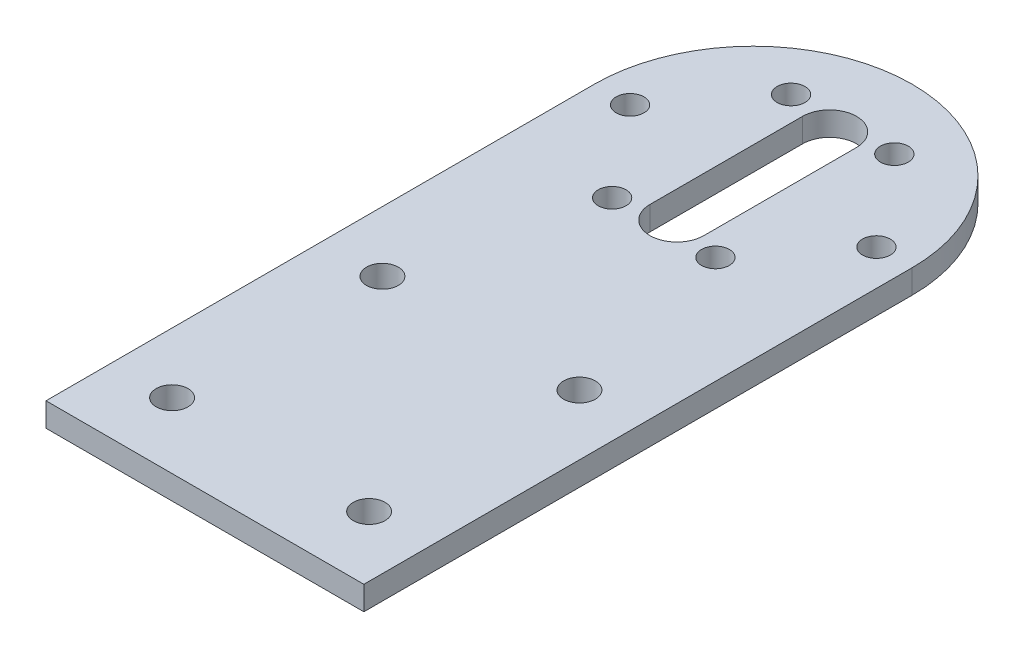
ISO-10303-21;
HEADER;
FILE_DESCRIPTION(('STEP AP214'),'2;1');
FILE_NAME('part.step','',(''),(''),'','','');
FILE_SCHEMA(('AUTOMOTIVE_DESIGN { 1 0 10303 214 1 1 1 1 }'));
ENDSEC;
DATA;
#1=APPLICATION_CONTEXT('core data for automotive mechanical design processes');
#2=APPLICATION_PROTOCOL_DEFINITION('international standard','automotive_design',2000,#1);
#3=PRODUCT_CONTEXT('',#1,'mechanical');
#4=PRODUCT('Part','Part','',(#3));
#5=PRODUCT_RELATED_PRODUCT_CATEGORY('part','',(#4));
#6=PRODUCT_DEFINITION_FORMATION('','',#4);
#7=PRODUCT_DEFINITION_CONTEXT('part definition',#1,'design');
#8=PRODUCT_DEFINITION('design','',#6,#7);
#9=PRODUCT_DEFINITION_SHAPE('','',#8);
#10=(LENGTH_UNIT() NAMED_UNIT(*) SI_UNIT(.MILLI.,.METRE.));
#11=(NAMED_UNIT(*) PLANE_ANGLE_UNIT() SI_UNIT($,.RADIAN.));
#12=(NAMED_UNIT(*) SI_UNIT($,.STERADIAN.) SOLID_ANGLE_UNIT());
#13=UNCERTAINTY_MEASURE_WITH_UNIT(LENGTH_MEASURE(1.E-05),#10,'distance_accuracy_value','');
#14=(GEOMETRIC_REPRESENTATION_CONTEXT(3) GLOBAL_UNCERTAINTY_ASSIGNED_CONTEXT((#13)) GLOBAL_UNIT_ASSIGNED_CONTEXT((#10,
#11,#12)) REPRESENTATION_CONTEXT('',''));
#15=CARTESIAN_POINT('',(0.,0.,0.));
#16=DIRECTION('',(0.,0.,1.));
#17=DIRECTION('',(1.,0.,0.));
#18=AXIS2_PLACEMENT_3D('',#15,#16,#17);
#19=CARTESIAN_POINT('',(0.,3.,0.));
#20=DIRECTION('',(0.,1.,0.));
#21=DIRECTION('',(0.,0.,1.));
#22=AXIS2_PLACEMENT_3D('',#19,#20,#21);
#23=PLANE('',#22);
#24=CARTESIAN_POINT('',(12.3981281081364,3.,34.2650323611915));
#25=DIRECTION('',(0.,1.,0.));
#26=DIRECTION('',(0.,0.,1.));
#27=AXIS2_PLACEMENT_3D('',#24,#25,#26);
#28=CIRCLE('',#27,2.);
#29=CARTESIAN_POINT('',(12.3981281081364,3.,36.2650323611915));
#30=VERTEX_POINT('',#29);
#31=EDGE_CURVE('E143',#30,#30,#28,.T.);
#32=ORIENTED_EDGE('',*,*,#31,.F.);
#33=EDGE_LOOP('',(#32));
#34=FACE_BOUND('',#33,.T.);
#35=CARTESIAN_POINT('',(-12.3981281081364,3.,34.2650323611915));
#36=DIRECTION('',(0.,1.,0.));
#37=DIRECTION('',(0.,0.,1.));
#38=AXIS2_PLACEMENT_3D('',#35,#36,#37);
#39=CIRCLE('',#38,2.);
#40=CARTESIAN_POINT('',(-12.3981281081364,3.,36.2650323611915));
#41=VERTEX_POINT('',#40);
#42=EDGE_CURVE('E155',#41,#41,#39,.T.);
#43=ORIENTED_EDGE('',*,*,#42,.F.);
#44=EDGE_LOOP('',(#43));
#45=FACE_BOUND('',#44,.T.);
#46=CARTESIAN_POINT('',(-6.5,3.,11.2583302491978));
#47=DIRECTION('',(0.,1.,0.));
#48=DIRECTION('',(0.,0.,1.));
#49=AXIS2_PLACEMENT_3D('',#46,#47,#48);
#50=CIRCLE('',#49,1.75);
#51=CARTESIAN_POINT('',(-6.5,3.,13.0083302491978));
#52=VERTEX_POINT('',#51);
#53=EDGE_CURVE('E167',#52,#52,#50,.T.);
#54=ORIENTED_EDGE('',*,*,#53,.F.);
#55=EDGE_LOOP('',(#54));
#56=FACE_BOUND('',#55,.T.);
#57=CARTESIAN_POINT('',(-15.5,3.,0.));
#58=DIRECTION('',(0.,1.,0.));
#59=DIRECTION('',(0.,0.,1.));
#60=AXIS2_PLACEMENT_3D('',#57,#58,#59);
#61=CIRCLE('',#60,1.75);
#62=CARTESIAN_POINT('',(-15.5,3.,1.75));
#63=VERTEX_POINT('',#62);
#64=EDGE_CURVE('E179',#63,#63,#61,.T.);
#65=ORIENTED_EDGE('',*,*,#64,.F.);
#66=EDGE_LOOP('',(#65));
#67=FACE_BOUND('',#66,.T.);
#68=CARTESIAN_POINT('',(-6.5,3.,-11.2583302491978));
#69=DIRECTION('',(0.,1.,0.));
#70=DIRECTION('',(0.,0.,1.));
#71=AXIS2_PLACEMENT_3D('',#68,#69,#70);
#72=CIRCLE('',#71,1.75);
#73=CARTESIAN_POINT('',(-6.5,3.,-9.50833024919776));
#74=VERTEX_POINT('',#73);
#75=EDGE_CURVE('E191',#74,#74,#72,.T.);
#76=ORIENTED_EDGE('',*,*,#75,.F.);
#77=EDGE_LOOP('',(#76));
#78=FACE_BOUND('',#77,.T.);
#79=CARTESIAN_POINT('',(0.,3.,0.));
#80=DIRECTION('',(0.,1.,0.));
#81=DIRECTION('',(0.,0.,1.));
#82=AXIS2_PLACEMENT_3D('',#79,#80,#81);
#83=CIRCLE('',#82,20.);
#84=CARTESIAN_POINT('',(20.,3.,0.));
#85=VERTEX_POINT('',#84);
#86=CARTESIAN_POINT('',(-20.,3.,0.));
#87=VERTEX_POINT('',#86);
#88=EDGE_CURVE('E197',#85,#87,#83,.T.);
#89=ORIENTED_EDGE('',*,*,#88,.T.);
#90=DIRECTION('',(0.,0.,1.));
#91=VECTOR('',#90,1.);
#92=CARTESIAN_POINT('',(-20.,3.,0.));
#93=LINE('',#92,#91);
#94=CARTESIAN_POINT('',(-20.,3.,69.));
#95=VERTEX_POINT('',#94);
#96=EDGE_CURVE('E200',#87,#95,#93,.T.);
#97=ORIENTED_EDGE('',*,*,#96,.T.);
#98=DIRECTION('',(1.,0.,0.));
#99=VECTOR('',#98,1.);
#100=CARTESIAN_POINT('',(-20.,3.,69.));
#101=LINE('',#100,#99);
#102=CARTESIAN_POINT('',(20.,3.,69.));
#103=VERTEX_POINT('',#102);
#104=EDGE_CURVE('E203',#95,#103,#101,.T.);
#105=ORIENTED_EDGE('',*,*,#104,.T.);
#106=DIRECTION('',(0.,0.,-1.));
#107=VECTOR('',#106,1.);
#108=CARTESIAN_POINT('',(20.,3.,69.));
#109=LINE('',#108,#107);
#110=EDGE_CURVE('E205',#103,#85,#109,.T.);
#111=ORIENTED_EDGE('',*,*,#110,.T.);
#112=EDGE_LOOP('',(#89,#97,#105,#111));
#113=FACE_BOUND('',#112,.T.);
#114=CARTESIAN_POINT('',(6.5,3.,-11.2583302491978));
#115=DIRECTION('',(0.,1.,0.));
#116=DIRECTION('',(0.,0.,1.));
#117=AXIS2_PLACEMENT_3D('',#114,#115,#116);
#118=CIRCLE('',#117,1.75);
#119=CARTESIAN_POINT('',(6.5,3.,-9.50833024919776));
#120=VERTEX_POINT('',#119);
#121=EDGE_CURVE('E185',#120,#120,#118,.T.);
#122=ORIENTED_EDGE('',*,*,#121,.F.);
#123=EDGE_LOOP('',(#122));
#124=FACE_BOUND('',#123,.T.);
#125=CARTESIAN_POINT('',(15.5,3.,0.));
#126=DIRECTION('',(0.,1.,0.));
#127=DIRECTION('',(0.,0.,1.));
#128=AXIS2_PLACEMENT_3D('',#125,#126,#127);
#129=CIRCLE('',#128,1.75);
#130=CARTESIAN_POINT('',(15.5,3.,1.74999999999999));
#131=VERTEX_POINT('',#130);
#132=EDGE_CURVE('E173',#131,#131,#129,.T.);
#133=ORIENTED_EDGE('',*,*,#132,.F.);
#134=EDGE_LOOP('',(#133));
#135=FACE_BOUND('',#134,.T.);
#136=CARTESIAN_POINT('',(6.5,3.,11.2583302491978));
#137=DIRECTION('',(0.,1.,0.));
#138=DIRECTION('',(0.,0.,1.));
#139=AXIS2_PLACEMENT_3D('',#136,#137,#138);
#140=CIRCLE('',#139,1.75);
#141=CARTESIAN_POINT('',(6.5,3.,13.0083302491978));
#142=VERTEX_POINT('',#141);
#143=EDGE_CURVE('E161',#142,#142,#140,.T.);
#144=ORIENTED_EDGE('',*,*,#143,.F.);
#145=EDGE_LOOP('',(#144));
#146=FACE_BOUND('',#145,.T.);
#147=CARTESIAN_POINT('',(-12.3981281081364,3.,60.7349676388085));
#148=DIRECTION('',(0.,1.,0.));
#149=DIRECTION('',(0.,0.,1.));
#150=AXIS2_PLACEMENT_3D('',#147,#148,#149);
#151=CIRCLE('',#150,2.);
#152=CARTESIAN_POINT('',(-12.3981281081364,3.,62.7349676388085));
#153=VERTEX_POINT('',#152);
#154=EDGE_CURVE('E149',#153,#153,#151,.T.);
#155=ORIENTED_EDGE('',*,*,#154,.F.);
#156=EDGE_LOOP('',(#155));
#157=FACE_BOUND('',#156,.T.);
#158=CARTESIAN_POINT('',(12.3981281081364,3.,60.7349676388085));
#159=DIRECTION('',(0.,1.,0.));
#160=DIRECTION('',(0.,0.,1.));
#161=AXIS2_PLACEMENT_3D('',#158,#159,#160);
#162=CIRCLE('',#161,2.);
#163=CARTESIAN_POINT('',(12.3981281081364,3.,62.7349676388085));
#164=VERTEX_POINT('',#163);
#165=EDGE_CURVE('E137',#164,#164,#162,.T.);
#166=ORIENTED_EDGE('',*,*,#165,.F.);
#167=EDGE_LOOP('',(#166));
#168=FACE_BOUND('',#167,.T.);
#169=DIRECTION('',(0.,0.,1.));
#170=VECTOR('',#169,1.);
#171=CARTESIAN_POINT('',(-3.39479084831647,3.,-9.60520915168353));
#172=LINE('',#171,#170);
#173=CARTESIAN_POINT('',(-3.39479084831647,3.,-9.60520915168353));
#174=VERTEX_POINT('',#173);
#175=CARTESIAN_POINT('',(-3.39479084831647,3.,9.60520915168353));
#176=VERTEX_POINT('',#175);
#177=EDGE_CURVE('E109',#174,#176,#172,.T.);
#178=ORIENTED_EDGE('',*,*,#177,.F.);
#179=CARTESIAN_POINT('',(0.,3.,-9.60520915168353));
#180=DIRECTION('',(0.,1.,0.));
#181=DIRECTION('',(0.,0.,1.));
#182=AXIS2_PLACEMENT_3D('',#179,#180,#181);
#183=CIRCLE('',#182,3.39479084831647);
#184=CARTESIAN_POINT('',(3.39479084831647,3.,-9.60520915168353));
#185=VERTEX_POINT('',#184);
#186=EDGE_CURVE('E101',#185,#174,#183,.T.);
#187=ORIENTED_EDGE('',*,*,#186,.F.);
#188=DIRECTION('',(0.,0.,-1.));
#189=VECTOR('',#188,1.);
#190=CARTESIAN_POINT('',(3.39479084831647,3.,-9.60520915168353));
#191=LINE('',#190,#189);
#192=CARTESIAN_POINT('',(3.39479084831647,3.,9.60520915168353));
#193=VERTEX_POINT('',#192);
#194=EDGE_CURVE('E123',#193,#185,#191,.T.);
#195=ORIENTED_EDGE('',*,*,#194,.F.);
#196=CARTESIAN_POINT('',(0.,3.,9.60520915168353));
#197=DIRECTION('',(0.,1.,0.));
#198=DIRECTION('',(0.,0.,1.));
#199=AXIS2_PLACEMENT_3D('',#196,#197,#198);
#200=CIRCLE('',#199,3.39479084831647);
#201=EDGE_CURVE('E121',#176,#193,#200,.T.);
#202=ORIENTED_EDGE('',*,*,#201,.F.);
#203=EDGE_LOOP('',(#178,#187,#195,#202));
#204=FACE_BOUND('',#203,.T.);
#205=ADVANCED_FACE('F36',(#34,#45,#56,#67,#78,#113,#124,#135,#146,#157,#168,#204),#23,.T.);
#206=CARTESIAN_POINT('',(0.,0.,0.));
#207=DIRECTION('',(0.,1.,0.));
#208=DIRECTION('',(0.,0.,1.));
#209=AXIS2_PLACEMENT_3D('',#206,#207,#208);
#210=PLANE('',#209);
#211=CARTESIAN_POINT('',(12.3981281081364,0.,60.7349676388085));
#212=DIRECTION('',(0.,1.,0.));
#213=DIRECTION('',(0.,0.,1.));
#214=AXIS2_PLACEMENT_3D('',#211,#212,#213);
#215=CIRCLE('',#214,2.);
#216=CARTESIAN_POINT('',(12.3981281081364,0.,62.7349676388085));
#217=VERTEX_POINT('',#216);
#218=EDGE_CURVE('E117',#217,#217,#215,.T.);
#219=ORIENTED_EDGE('',*,*,#218,.T.);
#220=EDGE_LOOP('',(#219));
#221=FACE_BOUND('',#220,.T.);
#222=CARTESIAN_POINT('',(12.3981281081364,0.,34.2650323611915));
#223=DIRECTION('',(0.,1.,0.));
#224=DIRECTION('',(0.,0.,1.));
#225=AXIS2_PLACEMENT_3D('',#222,#223,#224);
#226=CIRCLE('',#225,2.);
#227=CARTESIAN_POINT('',(12.3981281081364,0.,36.2650323611915));
#228=VERTEX_POINT('',#227);
#229=EDGE_CURVE('E140',#228,#228,#226,.T.);
#230=ORIENTED_EDGE('',*,*,#229,.T.);
#231=EDGE_LOOP('',(#230));
#232=FACE_BOUND('',#231,.T.);
#233=CARTESIAN_POINT('',(-12.3981281081364,0.,60.7349676388085));
#234=DIRECTION('',(0.,1.,0.));
#235=DIRECTION('',(0.,0.,1.));
#236=AXIS2_PLACEMENT_3D('',#233,#234,#235);
#237=CIRCLE('',#236,2.);
#238=CARTESIAN_POINT('',(-12.3981281081364,0.,62.7349676388085));
#239=VERTEX_POINT('',#238);
#240=EDGE_CURVE('E146',#239,#239,#237,.T.);
#241=ORIENTED_EDGE('',*,*,#240,.T.);
#242=EDGE_LOOP('',(#241));
#243=FACE_BOUND('',#242,.T.);
#244=CARTESIAN_POINT('',(-12.3981281081364,0.,34.2650323611915));
#245=DIRECTION('',(0.,1.,0.));
#246=DIRECTION('',(0.,0.,1.));
#247=AXIS2_PLACEMENT_3D('',#244,#245,#246);
#248=CIRCLE('',#247,2.);
#249=CARTESIAN_POINT('',(-12.3981281081364,0.,36.2650323611915));
#250=VERTEX_POINT('',#249);
#251=EDGE_CURVE('E152',#250,#250,#248,.T.);
#252=ORIENTED_EDGE('',*,*,#251,.T.);
#253=EDGE_LOOP('',(#252));
#254=FACE_BOUND('',#253,.T.);
#255=CARTESIAN_POINT('',(6.5,0.,11.2583302491978));
#256=DIRECTION('',(0.,1.,0.));
#257=DIRECTION('',(0.,0.,1.));
#258=AXIS2_PLACEMENT_3D('',#255,#256,#257);
#259=CIRCLE('',#258,1.75);
#260=CARTESIAN_POINT('',(6.5,0.,13.0083302491978));
#261=VERTEX_POINT('',#260);
#262=EDGE_CURVE('E158',#261,#261,#259,.T.);
#263=ORIENTED_EDGE('',*,*,#262,.T.);
#264=EDGE_LOOP('',(#263));
#265=FACE_BOUND('',#264,.T.);
#266=CARTESIAN_POINT('',(-6.5,0.,11.2583302491978));
#267=DIRECTION('',(0.,1.,0.));
#268=DIRECTION('',(0.,0.,1.));
#269=AXIS2_PLACEMENT_3D('',#266,#267,#268);
#270=CIRCLE('',#269,1.75);
#271=CARTESIAN_POINT('',(-6.5,0.,13.0083302491978));
#272=VERTEX_POINT('',#271);
#273=EDGE_CURVE('E164',#272,#272,#270,.T.);
#274=ORIENTED_EDGE('',*,*,#273,.T.);
#275=EDGE_LOOP('',(#274));
#276=FACE_BOUND('',#275,.T.);
#277=CARTESIAN_POINT('',(15.5,0.,0.));
#278=DIRECTION('',(0.,1.,0.));
#279=DIRECTION('',(0.,0.,1.));
#280=AXIS2_PLACEMENT_3D('',#277,#278,#279);
#281=CIRCLE('',#280,1.75);
#282=CARTESIAN_POINT('',(15.5,0.,1.74999999999999));
#283=VERTEX_POINT('',#282);
#284=EDGE_CURVE('E170',#283,#283,#281,.T.);
#285=ORIENTED_EDGE('',*,*,#284,.T.);
#286=EDGE_LOOP('',(#285));
#287=FACE_BOUND('',#286,.T.);
#288=CARTESIAN_POINT('',(-15.5,0.,0.));
#289=DIRECTION('',(0.,1.,0.));
#290=DIRECTION('',(0.,0.,1.));
#291=AXIS2_PLACEMENT_3D('',#288,#289,#290);
#292=CIRCLE('',#291,1.75);
#293=CARTESIAN_POINT('',(-15.5,0.,1.75));
#294=VERTEX_POINT('',#293);
#295=EDGE_CURVE('E176',#294,#294,#292,.T.);
#296=ORIENTED_EDGE('',*,*,#295,.T.);
#297=EDGE_LOOP('',(#296));
#298=FACE_BOUND('',#297,.T.);
#299=CARTESIAN_POINT('',(6.5,0.,-11.2583302491978));
#300=DIRECTION('',(0.,1.,0.));
#301=DIRECTION('',(0.,0.,1.));
#302=AXIS2_PLACEMENT_3D('',#299,#300,#301);
#303=CIRCLE('',#302,1.75);
#304=CARTESIAN_POINT('',(6.5,0.,-9.50833024919776));
#305=VERTEX_POINT('',#304);
#306=EDGE_CURVE('E182',#305,#305,#303,.T.);
#307=ORIENTED_EDGE('',*,*,#306,.T.);
#308=EDGE_LOOP('',(#307));
#309=FACE_BOUND('',#308,.T.);
#310=CARTESIAN_POINT('',(-6.5,0.,-11.2583302491978));
#311=DIRECTION('',(0.,1.,0.));
#312=DIRECTION('',(0.,0.,1.));
#313=AXIS2_PLACEMENT_3D('',#310,#311,#312);
#314=CIRCLE('',#313,1.75);
#315=CARTESIAN_POINT('',(-6.5,0.,-9.50833024919776));
#316=VERTEX_POINT('',#315);
#317=EDGE_CURVE('E188',#316,#316,#314,.T.);
#318=ORIENTED_EDGE('',*,*,#317,.T.);
#319=EDGE_LOOP('',(#318));
#320=FACE_BOUND('',#319,.T.);
#321=CARTESIAN_POINT('',(0.,0.,0.));
#322=DIRECTION('',(0.,1.,0.));
#323=DIRECTION('',(0.,0.,1.));
#324=AXIS2_PLACEMENT_3D('',#321,#322,#323);
#325=CIRCLE('',#324,20.);
#326=CARTESIAN_POINT('',(20.,0.,0.));
#327=VERTEX_POINT('',#326);
#328=CARTESIAN_POINT('',(-20.,0.,0.));
#329=VERTEX_POINT('',#328);
#330=EDGE_CURVE('E194',#327,#329,#325,.T.);
#331=ORIENTED_EDGE('',*,*,#330,.F.);
#332=DIRECTION('',(0.,0.,-1.));
#333=VECTOR('',#332,1.);
#334=CARTESIAN_POINT('',(20.,0.,69.));
#335=LINE('',#334,#333);
#336=CARTESIAN_POINT('',(20.,0.,69.));
#337=VERTEX_POINT('',#336);
#338=EDGE_CURVE('E201',#337,#327,#335,.T.);
#339=ORIENTED_EDGE('',*,*,#338,.F.);
#340=DIRECTION('',(1.,0.,0.));
#341=VECTOR('',#340,1.);
#342=CARTESIAN_POINT('',(-20.,0.,69.));
#343=LINE('',#342,#341);
#344=CARTESIAN_POINT('',(-20.,0.,69.));
#345=VERTEX_POINT('',#344);
#346=EDGE_CURVE('E212',#345,#337,#343,.T.);
#347=ORIENTED_EDGE('',*,*,#346,.F.);
#348=DIRECTION('',(0.,0.,1.));
#349=VECTOR('',#348,1.);
#350=CARTESIAN_POINT('',(-20.,0.,0.));
#351=LINE('',#350,#349);
#352=EDGE_CURVE('E210',#329,#345,#351,.T.);
#353=ORIENTED_EDGE('',*,*,#352,.F.);
#354=EDGE_LOOP('',(#331,#339,#347,#353));
#355=FACE_BOUND('',#354,.T.);
#356=CARTESIAN_POINT('',(0.,0.,-9.60520915168353));
#357=DIRECTION('',(0.,1.,0.));
#358=DIRECTION('',(0.,0.,1.));
#359=AXIS2_PLACEMENT_3D('',#356,#357,#358);
#360=CIRCLE('',#359,3.39479084831647);
#361=CARTESIAN_POINT('',(3.39479084831647,0.,-9.60520915168353));
#362=VERTEX_POINT('',#361);
#363=CARTESIAN_POINT('',(-3.39479084831647,0.,-9.60520915168353));
#364=VERTEX_POINT('',#363);
#365=EDGE_CURVE('E59',#362,#364,#360,.T.);
#366=ORIENTED_EDGE('',*,*,#365,.T.);
#367=DIRECTION('',(0.,0.,1.));
#368=VECTOR('',#367,1.);
#369=CARTESIAN_POINT('',(-3.39479084831647,0.,-9.60520915168353));
#370=LINE('',#369,#368);
#371=CARTESIAN_POINT('',(-3.39479084831647,0.,9.60520915168353));
#372=VERTEX_POINT('',#371);
#373=EDGE_CURVE('E116',#364,#372,#370,.T.);
#374=ORIENTED_EDGE('',*,*,#373,.T.);
#375=CARTESIAN_POINT('',(0.,0.,9.60520915168353));
#376=DIRECTION('',(0.,1.,0.));
#377=DIRECTION('',(0.,0.,1.));
#378=AXIS2_PLACEMENT_3D('',#375,#376,#377);
#379=CIRCLE('',#378,3.39479084831647);
#380=CARTESIAN_POINT('',(3.39479084831647,0.,9.60520915168353));
#381=VERTEX_POINT('',#380);
#382=EDGE_CURVE('E129',#372,#381,#379,.T.);
#383=ORIENTED_EDGE('',*,*,#382,.T.);
#384=DIRECTION('',(0.,0.,-1.));
#385=VECTOR('',#384,1.);
#386=CARTESIAN_POINT('',(3.39479084831647,0.,-9.60520915168353));
#387=LINE('',#386,#385);
#388=EDGE_CURVE('E110',#381,#362,#387,.T.);
#389=ORIENTED_EDGE('',*,*,#388,.T.);
#390=EDGE_LOOP('',(#366,#374,#383,#389));
#391=FACE_BOUND('',#390,.T.);
#392=ADVANCED_FACE('F230',(#221,#232,#243,#254,#265,#276,#287,#298,#309,#320,#355,#391),#210,.F.);
#393=CARTESIAN_POINT('',(0.,3.,0.));
#394=DIRECTION('',(0.,-1.,0.));
#395=DIRECTION('',(0.,0.,-1.));
#396=AXIS2_PLACEMENT_3D('',#393,#394,#395);
#397=CYLINDRICAL_SURFACE('',#396,20.);
#398=ORIENTED_EDGE('',*,*,#330,.T.);
#399=DIRECTION('',(0.,-1.,0.));
#400=VECTOR('',#399,1.);
#401=CARTESIAN_POINT('',(-20.,3.,0.));
#402=LINE('',#401,#400);
#403=EDGE_CURVE('E11',#87,#329,#402,.T.);
#404=ORIENTED_EDGE('',*,*,#403,.F.);
#405=ORIENTED_EDGE('',*,*,#88,.F.);
#406=DIRECTION('',(0.,-1.,0.));
#407=VECTOR('',#406,1.);
#408=CARTESIAN_POINT('',(20.,3.,0.));
#409=LINE('',#408,#407);
#410=EDGE_CURVE('E207',#85,#327,#409,.T.);
#411=ORIENTED_EDGE('',*,*,#410,.T.);
#412=EDGE_LOOP('',(#398,#404,#405,#411));
#413=FACE_BOUND('',#412,.T.);
#414=ADVANCED_FACE('F38',(#413),#397,.T.);
#415=CARTESIAN_POINT('',(-20.,3.,0.));
#416=DIRECTION('',(1.,0.,0.));
#417=DIRECTION('',(0.,0.,-1.));
#418=AXIS2_PLACEMENT_3D('',#415,#416,#417);
#419=PLANE('',#418);
#420=ORIENTED_EDGE('',*,*,#352,.T.);
#421=DIRECTION('',(0.,-1.,0.));
#422=VECTOR('',#421,1.);
#423=CARTESIAN_POINT('',(-20.,3.,69.));
#424=LINE('',#423,#422);
#425=EDGE_CURVE('E44',#95,#345,#424,.T.);
#426=ORIENTED_EDGE('',*,*,#425,.F.);
#427=ORIENTED_EDGE('',*,*,#96,.F.);
#428=ORIENTED_EDGE('',*,*,#403,.T.);
#429=EDGE_LOOP('',(#420,#426,#427,#428));
#430=FACE_BOUND('',#429,.T.);
#431=ADVANCED_FACE('F241',(#430),#419,.F.);
#432=CARTESIAN_POINT('',(-20.,3.,69.));
#433=DIRECTION('',(0.,0.,-1.));
#434=DIRECTION('',(-1.,0.,0.));
#435=AXIS2_PLACEMENT_3D('',#432,#433,#434);
#436=PLANE('',#435);
#437=ORIENTED_EDGE('',*,*,#346,.T.);
#438=DIRECTION('',(0.,-1.,0.));
#439=VECTOR('',#438,1.);
#440=CARTESIAN_POINT('',(20.,3.,69.));
#441=LINE('',#440,#439);
#442=EDGE_CURVE('E217',#103,#337,#441,.T.);
#443=ORIENTED_EDGE('',*,*,#442,.F.);
#444=ORIENTED_EDGE('',*,*,#104,.F.);
#445=ORIENTED_EDGE('',*,*,#425,.T.);
#446=EDGE_LOOP('',(#437,#443,#444,#445));
#447=FACE_BOUND('',#446,.T.);
#448=ADVANCED_FACE('F224',(#447),#436,.F.);
#449=CARTESIAN_POINT('',(20.,3.,69.));
#450=DIRECTION('',(-1.,0.,0.));
#451=DIRECTION('',(0.,0.,1.));
#452=AXIS2_PLACEMENT_3D('',#449,#450,#451);
#453=PLANE('',#452);
#454=ORIENTED_EDGE('',*,*,#338,.T.);
#455=ORIENTED_EDGE('',*,*,#410,.F.);
#456=ORIENTED_EDGE('',*,*,#110,.F.);
#457=ORIENTED_EDGE('',*,*,#442,.T.);
#458=EDGE_LOOP('',(#454,#455,#456,#457));
#459=FACE_BOUND('',#458,.T.);
#460=ADVANCED_FACE('F234',(#459),#453,.F.);
#461=CARTESIAN_POINT('',(-6.5,3.,-11.2583302491978));
#462=DIRECTION('',(0.,-1.,0.));
#463=DIRECTION('',(0.,0.,-1.));
#464=AXIS2_PLACEMENT_3D('',#461,#462,#463);
#465=CYLINDRICAL_SURFACE('',#464,1.75);
#466=ORIENTED_EDGE('',*,*,#75,.T.);
#467=EDGE_LOOP('',(#466));
#468=FACE_BOUND('',#467,.T.);
#469=ORIENTED_EDGE('',*,*,#317,.F.);
#470=EDGE_LOOP('',(#469));
#471=FACE_BOUND('',#470,.T.);
#472=ADVANCED_FACE('F259',(#468,#471),#465,.F.);
#473=CARTESIAN_POINT('',(6.5,3.,-11.2583302491978));
#474=DIRECTION('',(0.,-1.,0.));
#475=DIRECTION('',(0.,0.,-1.));
#476=AXIS2_PLACEMENT_3D('',#473,#474,#475);
#477=CYLINDRICAL_SURFACE('',#476,1.75);
#478=ORIENTED_EDGE('',*,*,#121,.T.);
#479=EDGE_LOOP('',(#478));
#480=FACE_BOUND('',#479,.T.);
#481=ORIENTED_EDGE('',*,*,#306,.F.);
#482=EDGE_LOOP('',(#481));
#483=FACE_BOUND('',#482,.T.);
#484=ADVANCED_FACE('F266',(#480,#483),#477,.F.);
#485=CARTESIAN_POINT('',(-15.5,3.,0.));
#486=DIRECTION('',(0.,-1.,0.));
#487=DIRECTION('',(0.,0.,-1.));
#488=AXIS2_PLACEMENT_3D('',#485,#486,#487);
#489=CYLINDRICAL_SURFACE('',#488,1.75);
#490=ORIENTED_EDGE('',*,*,#64,.T.);
#491=EDGE_LOOP('',(#490));
#492=FACE_BOUND('',#491,.T.);
#493=ORIENTED_EDGE('',*,*,#295,.F.);
#494=EDGE_LOOP('',(#493));
#495=FACE_BOUND('',#494,.T.);
#496=ADVANCED_FACE('F271',(#492,#495),#489,.F.);
#497=CARTESIAN_POINT('',(15.5,3.,0.));
#498=DIRECTION('',(0.,-1.,0.));
#499=DIRECTION('',(0.,0.,-1.));
#500=AXIS2_PLACEMENT_3D('',#497,#498,#499);
#501=CYLINDRICAL_SURFACE('',#500,1.75);
#502=ORIENTED_EDGE('',*,*,#132,.T.);
#503=EDGE_LOOP('',(#502));
#504=FACE_BOUND('',#503,.T.);
#505=ORIENTED_EDGE('',*,*,#284,.F.);
#506=EDGE_LOOP('',(#505));
#507=FACE_BOUND('',#506,.T.);
#508=ADVANCED_FACE('F281',(#504,#507),#501,.F.);
#509=CARTESIAN_POINT('',(-6.5,3.,11.2583302491978));
#510=DIRECTION('',(0.,-1.,0.));
#511=DIRECTION('',(0.,0.,-1.));
#512=AXIS2_PLACEMENT_3D('',#509,#510,#511);
#513=CYLINDRICAL_SURFACE('',#512,1.75);
#514=ORIENTED_EDGE('',*,*,#53,.T.);
#515=EDGE_LOOP('',(#514));
#516=FACE_BOUND('',#515,.T.);
#517=ORIENTED_EDGE('',*,*,#273,.F.);
#518=EDGE_LOOP('',(#517));
#519=FACE_BOUND('',#518,.T.);
#520=ADVANCED_FACE('F288',(#516,#519),#513,.F.);
#521=CARTESIAN_POINT('',(6.5,3.,11.2583302491978));
#522=DIRECTION('',(0.,-1.,0.));
#523=DIRECTION('',(0.,0.,-1.));
#524=AXIS2_PLACEMENT_3D('',#521,#522,#523);
#525=CYLINDRICAL_SURFACE('',#524,1.75);
#526=ORIENTED_EDGE('',*,*,#143,.T.);
#527=EDGE_LOOP('',(#526));
#528=FACE_BOUND('',#527,.T.);
#529=ORIENTED_EDGE('',*,*,#262,.F.);
#530=EDGE_LOOP('',(#529));
#531=FACE_BOUND('',#530,.T.);
#532=ADVANCED_FACE('F292',(#528,#531),#525,.F.);
#533=CARTESIAN_POINT('',(-12.3981281081364,3.,34.2650323611915));
#534=DIRECTION('',(0.,-1.,0.));
#535=DIRECTION('',(0.,0.,-1.));
#536=AXIS2_PLACEMENT_3D('',#533,#534,#535);
#537=CYLINDRICAL_SURFACE('',#536,2.);
#538=ORIENTED_EDGE('',*,*,#42,.T.);
#539=EDGE_LOOP('',(#538));
#540=FACE_BOUND('',#539,.T.);
#541=ORIENTED_EDGE('',*,*,#251,.F.);
#542=EDGE_LOOP('',(#541));
#543=FACE_BOUND('',#542,.T.);
#544=ADVANCED_FACE('F296',(#540,#543),#537,.F.);
#545=CARTESIAN_POINT('',(-12.3981281081364,3.,60.7349676388085));
#546=DIRECTION('',(0.,-1.,0.));
#547=DIRECTION('',(0.,0.,-1.));
#548=AXIS2_PLACEMENT_3D('',#545,#546,#547);
#549=CYLINDRICAL_SURFACE('',#548,2.);
#550=ORIENTED_EDGE('',*,*,#154,.T.);
#551=EDGE_LOOP('',(#550));
#552=FACE_BOUND('',#551,.T.);
#553=ORIENTED_EDGE('',*,*,#240,.F.);
#554=EDGE_LOOP('',(#553));
#555=FACE_BOUND('',#554,.T.);
#556=ADVANCED_FACE('F300',(#552,#555),#549,.F.);
#557=CARTESIAN_POINT('',(12.3981281081364,3.,34.2650323611915));
#558=DIRECTION('',(0.,-1.,0.));
#559=DIRECTION('',(0.,0.,-1.));
#560=AXIS2_PLACEMENT_3D('',#557,#558,#559);
#561=CYLINDRICAL_SURFACE('',#560,2.);
#562=ORIENTED_EDGE('',*,*,#31,.T.);
#563=EDGE_LOOP('',(#562));
#564=FACE_BOUND('',#563,.T.);
#565=ORIENTED_EDGE('',*,*,#229,.F.);
#566=EDGE_LOOP('',(#565));
#567=FACE_BOUND('',#566,.T.);
#568=ADVANCED_FACE('F304',(#564,#567),#561,.F.);
#569=CARTESIAN_POINT('',(12.3981281081364,3.,60.7349676388085));
#570=DIRECTION('',(0.,-1.,0.));
#571=DIRECTION('',(0.,0.,-1.));
#572=AXIS2_PLACEMENT_3D('',#569,#570,#571);
#573=CYLINDRICAL_SURFACE('',#572,2.);
#574=ORIENTED_EDGE('',*,*,#165,.T.);
#575=EDGE_LOOP('',(#574));
#576=FACE_BOUND('',#575,.T.);
#577=ORIENTED_EDGE('',*,*,#218,.F.);
#578=EDGE_LOOP('',(#577));
#579=FACE_BOUND('',#578,.T.);
#580=ADVANCED_FACE('F308',(#576,#579),#573,.F.);
#581=CARTESIAN_POINT('',(0.,3.,-9.60520915168353));
#582=DIRECTION('',(0.,-1.,0.));
#583=DIRECTION('',(0.,0.,-1.));
#584=AXIS2_PLACEMENT_3D('',#581,#582,#583);
#585=CYLINDRICAL_SURFACE('',#584,3.39479084831647);
#586=ORIENTED_EDGE('',*,*,#365,.F.);
#587=DIRECTION('',(0.,-1.,0.));
#588=VECTOR('',#587,1.);
#589=CARTESIAN_POINT('',(3.39479084831647,3.,-9.60520915168353));
#590=LINE('',#589,#588);
#591=EDGE_CURVE('E105',#185,#362,#590,.T.);
#592=ORIENTED_EDGE('',*,*,#591,.F.);
#593=ORIENTED_EDGE('',*,*,#186,.T.);
#594=DIRECTION('',(0.,-1.,0.));
#595=VECTOR('',#594,1.);
#596=CARTESIAN_POINT('',(-3.39479084831647,3.,-9.60520915168353));
#597=LINE('',#596,#595);
#598=EDGE_CURVE('E104',#174,#364,#597,.T.);
#599=ORIENTED_EDGE('',*,*,#598,.T.);
#600=EDGE_LOOP('',(#586,#592,#593,#599));
#601=FACE_BOUND('',#600,.T.);
#602=ADVANCED_FACE('F103',(#601),#585,.F.);
#603=CARTESIAN_POINT('',(-3.39479084831647,3.,-9.60520915168353));
#604=DIRECTION('',(1.,0.,0.));
#605=DIRECTION('',(0.,0.,-1.));
#606=AXIS2_PLACEMENT_3D('',#603,#604,#605);
#607=PLANE('',#606);
#608=ORIENTED_EDGE('',*,*,#373,.F.);
#609=ORIENTED_EDGE('',*,*,#598,.F.);
#610=ORIENTED_EDGE('',*,*,#177,.T.);
#611=DIRECTION('',(0.,-1.,0.));
#612=VECTOR('',#611,1.);
#613=CARTESIAN_POINT('',(-3.39479084831647,3.,9.60520915168353));
#614=LINE('',#613,#612);
#615=EDGE_CURVE('E118',#176,#372,#614,.T.);
#616=ORIENTED_EDGE('',*,*,#615,.T.);
#617=EDGE_LOOP('',(#608,#609,#610,#616));
#618=FACE_BOUND('',#617,.T.);
#619=ADVANCED_FACE('F113',(#618),#607,.T.);
#620=CARTESIAN_POINT('',(0.,3.,9.60520915168353));
#621=DIRECTION('',(0.,-1.,0.));
#622=DIRECTION('',(0.,0.,-1.));
#623=AXIS2_PLACEMENT_3D('',#620,#621,#622);
#624=CYLINDRICAL_SURFACE('',#623,3.39479084831647);
#625=ORIENTED_EDGE('',*,*,#382,.F.);
#626=ORIENTED_EDGE('',*,*,#615,.F.);
#627=ORIENTED_EDGE('',*,*,#201,.T.);
#628=DIRECTION('',(0.,-1.,0.));
#629=VECTOR('',#628,1.);
#630=CARTESIAN_POINT('',(3.39479084831647,3.,9.60520915168353));
#631=LINE('',#630,#629);
#632=EDGE_CURVE('E51',#193,#381,#631,.T.);
#633=ORIENTED_EDGE('',*,*,#632,.T.);
#634=EDGE_LOOP('',(#625,#626,#627,#633));
#635=FACE_BOUND('',#634,.T.);
#636=ADVANCED_FACE('F317',(#635),#624,.F.);
#637=CARTESIAN_POINT('',(3.39479084831647,3.,-9.60520915168353));
#638=DIRECTION('',(-1.,0.,0.));
#639=DIRECTION('',(0.,0.,1.));
#640=AXIS2_PLACEMENT_3D('',#637,#638,#639);
#641=PLANE('',#640);
#642=ORIENTED_EDGE('',*,*,#388,.F.);
#643=ORIENTED_EDGE('',*,*,#632,.F.);
#644=ORIENTED_EDGE('',*,*,#194,.T.);
#645=ORIENTED_EDGE('',*,*,#591,.T.);
#646=EDGE_LOOP('',(#642,#643,#644,#645));
#647=FACE_BOUND('',#646,.T.);
#648=ADVANCED_FACE('F320',(#647),#641,.T.);
#649=CLOSED_SHELL('',(#205,#392,#414,#431,#448,#460,#472,#484,#496,#508,#520,#532,#544,#556,
#568,#580,#602,#619,#636,#648));
#650=MANIFOLD_SOLID_BREP('B2',#649);
#651=ADVANCED_BREP_SHAPE_REPRESENTATION('',(#18,#650),#14);
#652=SHAPE_DEFINITION_REPRESENTATION(#9,#651);
ENDSEC;
END-ISO-10303-21;
